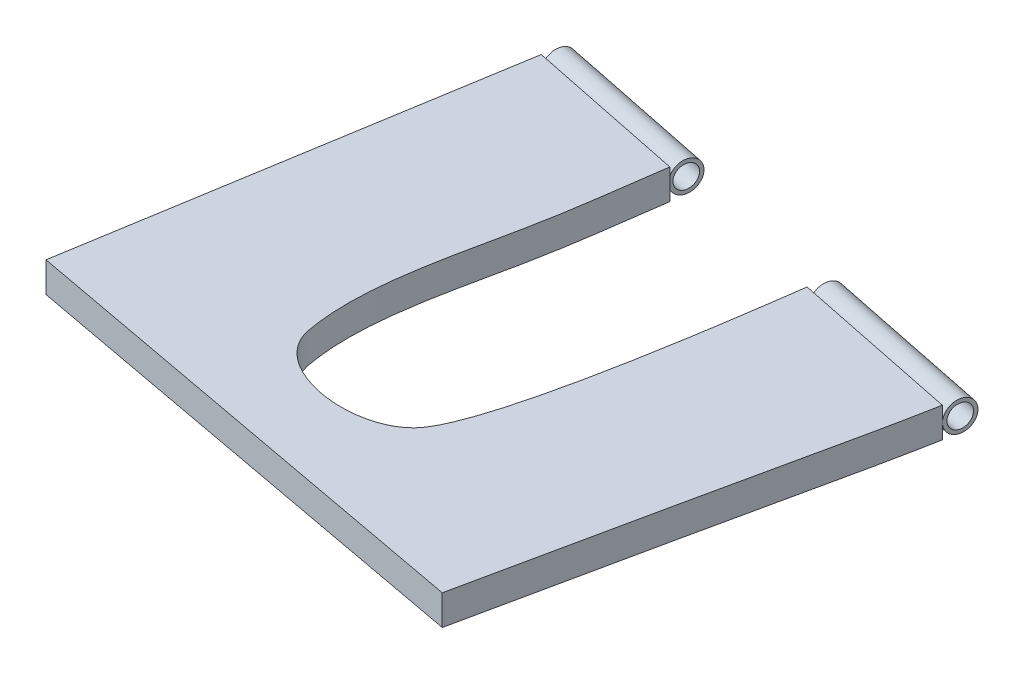
ISO-10303-21;
HEADER;
FILE_DESCRIPTION(('STEP AP214'),'2;1');
FILE_NAME('part.step','',(''),(''),'','','');
FILE_SCHEMA(('AUTOMOTIVE_DESIGN { 1 0 10303 214 1 1 1 1 }'));
ENDSEC;
DATA;
#1=APPLICATION_CONTEXT('core data for automotive mechanical design processes');
#2=APPLICATION_PROTOCOL_DEFINITION('international standard','automotive_design',2000,#1);
#3=PRODUCT_CONTEXT('',#1,'mechanical');
#4=PRODUCT('Part','Part','',(#3));
#5=PRODUCT_RELATED_PRODUCT_CATEGORY('part','',(#4));
#6=PRODUCT_DEFINITION_FORMATION('','',#4);
#7=PRODUCT_DEFINITION_CONTEXT('part definition',#1,'design');
#8=PRODUCT_DEFINITION('design','',#6,#7);
#9=PRODUCT_DEFINITION_SHAPE('','',#8);
#10=(LENGTH_UNIT() NAMED_UNIT(*) SI_UNIT(.MILLI.,.METRE.));
#11=(NAMED_UNIT(*) PLANE_ANGLE_UNIT() SI_UNIT($,.RADIAN.));
#12=(NAMED_UNIT(*) SI_UNIT($,.STERADIAN.) SOLID_ANGLE_UNIT());
#13=UNCERTAINTY_MEASURE_WITH_UNIT(LENGTH_MEASURE(1.E-05),#10,'distance_accuracy_value','');
#14=(GEOMETRIC_REPRESENTATION_CONTEXT(3) GLOBAL_UNCERTAINTY_ASSIGNED_CONTEXT((#13)) GLOBAL_UNIT_ASSIGNED_CONTEXT((#10,
#11,#12)) REPRESENTATION_CONTEXT('',''));
#15=CARTESIAN_POINT('',(0.,0.,0.));
#16=DIRECTION('',(0.,0.,1.));
#17=DIRECTION('',(1.,0.,0.));
#18=AXIS2_PLACEMENT_3D('',#15,#16,#17);
#19=CARTESIAN_POINT('',(34.3393409375104,28.367027058121,41.4201452566164));
#20=DIRECTION('',(-0.979714932282565,0.,-0.200396236148708));
#21=DIRECTION('',(-0.132005290547478,-0.752386940692541,0.645359198232112));
#22=AXIS2_PLACEMENT_3D('',#19,#20,#21);
#23=CYLINDRICAL_SURFACE('',#22,0.5);
#24=CARTESIAN_POINT('',(16.9298065908492,28.367027058121,37.8591041402539));
#25=DIRECTION('',(0.979714932282565,0.,0.200396236148708));
#26=DIRECTION('',(0.132005290547478,0.752386940692541,-0.645359198232112));
#27=AXIS2_PLACEMENT_3D('',#24,#25,#26);
#28=CIRCLE('',#27,0.5);
#29=CARTESIAN_POINT('',(16.9958092361229,28.7432205284673,37.5364245411378));
#30=VERTEX_POINT('',#29);
#31=EDGE_CURVE('P0_E56',#30,#30,#28,.T.);
#32=ORIENTED_EDGE('',*,*,#31,.T.);
#33=EDGE_LOOP('',(#32));
#34=FACE_BOUND('',#33,.T.);
#35=CARTESIAN_POINT('',(22.2467057490344,28.367027058121,38.9466516953372));
#36=DIRECTION('',(-0.979714932282565,0.,-0.200396236148708));
#37=DIRECTION('',(-0.200396236148708,0.,0.979714932282565));
#38=AXIS2_PLACEMENT_3D('',#35,#36,#37);
#39=CIRCLE('',#38,0.5);
#40=CARTESIAN_POINT('',(22.1465076309601,28.367027058121,39.4365091614785));
#41=VERTEX_POINT('',#40);
#42=EDGE_CURVE('P0_E46',#41,#41,#39,.T.);
#43=ORIENTED_EDGE('',*,*,#42,.T.);
#44=EDGE_LOOP('',(#43));
#45=FACE_BOUND('',#44,.T.);
#46=ADVANCED_FACE('P0_F42',(#34,#45),#23,.T.);
#47=CARTESIAN_POINT('',(34.3393409375104,28.367027058121,41.4201452566164));
#48=DIRECTION('',(-0.979714932282565,0.,-0.200396236148708));
#49=DIRECTION('',(-0.132005290547478,-0.752386940692541,0.645359198232112));
#50=AXIS2_PLACEMENT_3D('',#47,#48,#49);
#51=CYLINDRICAL_SURFACE('',#50,0.375);
#52=CARTESIAN_POINT('',(22.2467057490344,28.367027058121,38.9466516953372));
#53=DIRECTION('',(-0.979714932282565,0.,-0.200396236148708));
#54=DIRECTION('',(-0.200396236148708,0.,0.979714932282565));
#55=AXIS2_PLACEMENT_3D('',#52,#53,#54);
#56=CIRCLE('',#55,0.375);
#57=CARTESIAN_POINT('',(22.1715571604787,28.367027058121,39.3140447949432));
#58=VERTEX_POINT('',#57);
#59=EDGE_CURVE('P0_E11',#58,#58,#56,.T.);
#60=ORIENTED_EDGE('',*,*,#59,.F.);
#61=EDGE_LOOP('',(#60));
#62=FACE_BOUND('',#61,.T.);
#63=CARTESIAN_POINT('',(16.9298065908492,28.367027058121,37.8591041402539));
#64=DIRECTION('',(0.979714932282565,0.,0.200396236148708));
#65=DIRECTION('',(0.132005290547478,0.752386940692541,-0.645359198232112));
#66=AXIS2_PLACEMENT_3D('',#63,#64,#65);
#67=CIRCLE('',#66,0.375);
#68=CARTESIAN_POINT('',(16.9793085748045,28.6491721608807,37.6170944409168));
#69=VERTEX_POINT('',#68);
#70=EDGE_CURVE('P0_E50',#69,#69,#67,.T.);
#71=ORIENTED_EDGE('',*,*,#70,.F.);
#72=EDGE_LOOP('',(#71));
#73=FACE_BOUND('',#72,.T.);
#74=ADVANCED_FACE('P0_F44',(#62,#73),#51,.F.);
#75=CARTESIAN_POINT('',(16.9298065908492,28.367027058121,37.8591041402539));
#76=DIRECTION('',(0.979714932282565,0.,0.200396236148708));
#77=DIRECTION('',(0.132005290547478,0.752386940692541,-0.645359198232112));
#78=AXIS2_PLACEMENT_3D('',#75,#76,#77);
#79=PLANE('',#78);
#80=ORIENTED_EDGE('',*,*,#31,.F.);
#81=EDGE_LOOP('',(#80));
#82=FACE_BOUND('',#81,.T.);
#83=ORIENTED_EDGE('',*,*,#70,.T.);
#84=EDGE_LOOP('',(#83));
#85=FACE_BOUND('',#84,.T.);
#86=ADVANCED_FACE('P0_F66',(#82,#85),#79,.F.);
#87=CARTESIAN_POINT('',(22.1465076309606,27.4446270581241,39.4365091614761));
#88=DIRECTION('',(-0.979714932282565,0.,-0.200396236148708));
#89=DIRECTION('',(-0.200396236148708,0.,0.979714932282565));
#90=AXIS2_PLACEMENT_3D('',#87,#88,#89);
#91=PLANE('',#90);
#92=ORIENTED_EDGE('',*,*,#59,.T.);
#93=EDGE_LOOP('',(#92));
#94=FACE_BOUND('',#93,.T.);
#95=ORIENTED_EDGE('',*,*,#42,.F.);
#96=EDGE_LOOP('',(#95));
#97=FACE_BOUND('',#96,.T.);
#98=ADVANCED_FACE('P0_F64',(#94,#97),#91,.F.);
#99=CLOSED_SHELL('',(#46,#74,#86,#98));
#100=MANIFOLD_SOLID_BREP('P0_B2',#99);
#101=CARTESIAN_POINT('',(34.3393409375104,28.367027058121,41.4201452566164));
#102=DIRECTION('',(-0.979714932282565,0.,-0.200396236148708));
#103=DIRECTION('',(-0.132005290547478,-0.752386940692541,0.645359198232112));
#104=AXIS2_PLACEMENT_3D('',#101,#102,#103);
#105=CYLINDRICAL_SURFACE('',#104,0.5);
#106=CARTESIAN_POINT('',(28.1249953427298,28.367027058121,40.1490291122295));
#107=DIRECTION('',(0.979714932282565,0.,0.200396236148708));
#108=DIRECTION('',(0.200396236148708,0.,-0.979714932282565));
#109=AXIS2_PLACEMENT_3D('',#106,#107,#108);
#110=CIRCLE('',#109,0.5);
#111=CARTESIAN_POINT('',(28.2251934608042,28.367027058121,39.6591716460882));
#112=VERTEX_POINT('',#111);
#113=EDGE_CURVE('P0_E115',#112,#112,#110,.T.);
#114=ORIENTED_EDGE('',*,*,#113,.T.);
#115=EDGE_LOOP('',(#114));
#116=FACE_BOUND('',#115,.T.);
#117=CARTESIAN_POINT('',(33.692337196231,28.367027058121,41.2878035822638));
#118=DIRECTION('',(0.979714932282566,0.,0.200396236148705));
#119=DIRECTION('',(0.200396236148705,0.,-0.979714932282566));
#120=AXIS2_PLACEMENT_3D('',#117,#118,#119);
#121=CIRCLE('',#120,0.5);
#122=CARTESIAN_POINT('',(33.7925353143053,28.367027058121,40.7979461161225));
#123=VERTEX_POINT('',#122);
#124=EDGE_CURVE('P0_E41',#123,#123,#121,.T.);
#125=ORIENTED_EDGE('',*,*,#124,.F.);
#126=EDGE_LOOP('',(#125));
#127=FACE_BOUND('',#126,.T.);
#128=ADVANCED_FACE('P0_F103',(#116,#127),#105,.T.);
#129=CARTESIAN_POINT('',(40.4453817701932,1.1135307542517E-13,8.27291899844854));
#130=DIRECTION('',(0.979714932282566,0.,0.200396236148705));
#131=DIRECTION('',(0.200396236148705,0.,-0.979714932282566));
#132=AXIS2_PLACEMENT_3D('',#129,#130,#131);
#133=PLANE('',#132);
#134=CARTESIAN_POINT('',(33.692337196231,28.367027058121,41.2878035822638));
#135=DIRECTION('',(0.979714932282566,0.,0.200396236148705));
#136=DIRECTION('',(0.200396236148705,0.,-0.979714932282566));
#137=AXIS2_PLACEMENT_3D('',#134,#135,#136);
#138=CIRCLE('',#137,0.375);
#139=CARTESIAN_POINT('',(33.7674857847867,28.367027058121,40.9204104826578));
#140=VERTEX_POINT('',#139);
#141=EDGE_CURVE('P0_E110',#140,#140,#138,.T.);
#142=ORIENTED_EDGE('',*,*,#141,.F.);
#143=EDGE_LOOP('',(#142));
#144=FACE_BOUND('',#143,.T.);
#145=ORIENTED_EDGE('',*,*,#124,.T.);
#146=EDGE_LOOP('',(#145));
#147=FACE_BOUND('',#146,.T.);
#148=ADVANCED_FACE('P0_F129',(#144,#147),#133,.T.);
#149=CARTESIAN_POINT('',(34.3393409375104,28.367027058121,41.4201452566164));
#150=DIRECTION('',(-0.979714932282565,0.,-0.200396236148708));
#151=DIRECTION('',(-0.132005290547478,-0.752386940692541,0.645359198232112));
#152=AXIS2_PLACEMENT_3D('',#149,#150,#151);
#153=CYLINDRICAL_SURFACE('',#152,0.375);
#154=CARTESIAN_POINT('',(28.1249953427298,28.367027058121,40.1490291122295));
#155=DIRECTION('',(0.979714932282565,0.,0.200396236148708));
#156=DIRECTION('',(0.200396236148708,0.,-0.979714932282565));
#157=AXIS2_PLACEMENT_3D('',#154,#155,#156);
#158=CIRCLE('',#157,0.375);
#159=CARTESIAN_POINT('',(28.2001439312856,28.367027058121,39.7816360126235));
#160=VERTEX_POINT('',#159);
#161=EDGE_CURVE('P0_E106',#160,#160,#158,.T.);
#162=ORIENTED_EDGE('',*,*,#161,.F.);
#163=EDGE_LOOP('',(#162));
#164=FACE_BOUND('',#163,.T.);
#165=ORIENTED_EDGE('',*,*,#141,.T.);
#166=EDGE_LOOP('',(#165));
#167=FACE_BOUND('',#166,.T.);
#168=ADVANCED_FACE('P0_F126',(#164,#167),#153,.F.);
#169=CARTESIAN_POINT('',(28.3029419316506,27.4446270581241,39.2790680108389));
#170=DIRECTION('',(0.979714932282565,0.,0.200396236148708));
#171=DIRECTION('',(0.200396236148708,0.,-0.979714932282565));
#172=AXIS2_PLACEMENT_3D('',#169,#170,#171);
#173=PLANE('',#172);
#174=ORIENTED_EDGE('',*,*,#161,.T.);
#175=EDGE_LOOP('',(#174));
#176=FACE_BOUND('',#175,.T.);
#177=ORIENTED_EDGE('',*,*,#113,.F.);
#178=EDGE_LOOP('',(#177));
#179=FACE_BOUND('',#178,.T.);
#180=ADVANCED_FACE('P0_F123',(#176,#179),#173,.F.);
#181=CLOSED_SHELL('',(#128,#148,#168,#180));
#182=MANIFOLD_SOLID_BREP('P0_B6',#181);
#183=CARTESIAN_POINT('',(36.6387428812628,28.8670270581241,-14.2615422954194));
#184=DIRECTION('',(0.,1.,0.));
#185=DIRECTION('',(0.,0.,1.));
#186=AXIS2_PLACEMENT_3D('',#183,#184,#185);
#187=PLANE('',#186);
#188=DIRECTION('',(0.979714932282565,0.,0.200396236148708));
#189=VECTOR('',#188,1.);
#190=CARTESIAN_POINT('',(16.8301205467723,28.8670270581241,38.3490663488012));
#191=LINE('',#190,#189);
#192=CARTESIAN_POINT('',(16.8301205467723,28.8670270581241,38.3490663488012));
#193=VERTEX_POINT('',#192);
#194=CARTESIAN_POINT('',(22.2008761425066,28.8670270581241,39.4476299933832));
#195=VERTEX_POINT('',#194);
#196=EDGE_CURVE('P1_E61',#193,#195,#191,.T.);
#197=ORIENTED_EDGE('',*,*,#196,.F.);
#198=DIRECTION('',(-0.162010149383469,0.,0.986789091699308));
#199=VECTOR('',#198,1.);
#200=CARTESIAN_POINT('',(14.50947597592,28.8670270581241,52.4839014621741));
#201=LINE('',#200,#199);
#202=CARTESIAN_POINT('',(14.50947597592,28.8670270581241,52.4839014621741));
#203=VERTEX_POINT('',#202);
#204=EDGE_CURVE('P1_E89',#193,#203,#201,.T.);
#205=ORIENTED_EDGE('',*,*,#204,.T.);
#206=DIRECTION('',(0.983229382627469,0.,0.182373191938966));
#207=VECTOR('',#206,1.);
#208=CARTESIAN_POINT('',(30.6744525972207,28.8670270581241,55.482243899996));
#209=LINE('',#208,#207);
#210=CARTESIAN_POINT('',(30.6744525972207,28.8670270581241,55.482243899996));
#211=VERTEX_POINT('',#210);
#212=EDGE_CURVE('P1_E41',#203,#211,#209,.T.);
#213=ORIENTED_EDGE('',*,*,#212,.T.);
#214=CARTESIAN_POINT('',(30.6744525972207,28.8670270581241,55.482243899996));
#215=CARTESIAN_POINT('',(31.4566288853481,28.8670270581241,51.8320878887345));
#216=CARTESIAN_POINT('',(32.2156641647427,28.8670270581241,48.176896262527));
#217=CARTESIAN_POINT('',(33.020981461603,28.8670270581241,44.5317758662117));
#218=CARTESIAN_POINT('',(34.0674237797334,28.8670270581241,39.7952474788846));
#219=CARTESIAN_POINT('',(34.7004152100653,28.8670270581241,34.97662423419));
#220=CARTESIAN_POINT('',(35.4978730406733,28.8670270581241,30.1918772505417));
#221=B_SPLINE_CURVE_WITH_KNOTS('',3,(#214,#215,#216,#217,#218,#219,#220),.UNSPECIFIED.,.F.,.F.,
(4,3,4),(0.,1.,2.),.UNSPECIFIED.);
#222=CARTESIAN_POINT('',(33.5857089999997,28.8670270581241,41.7763458051432));
#223=VERTEX_POINT('',#222);
#224=EDGE_CURVE('P1_E102',#211,#223,#221,.T.);
#225=ORIENTED_EDGE('',*,*,#224,.T.);
#226=CARTESIAN_POINT('',(27.9368355887746,28.8670270581241,40.6208944255744));
#227=VERTEX_POINT('',#226);
#228=EDGE_CURVE('P1_E94',#227,#223,#191,.T.);
#229=ORIENTED_EDGE('',*,*,#228,.F.);
#230=CARTESIAN_POINT('',(22.2008761425066,28.8670270581241,39.4476299933832));
#231=CARTESIAN_POINT('',(22.0270591895894,28.8670270581241,40.6208944255744));
#232=CARTESIAN_POINT('',(21.8879252653,28.8670270581241,41.7998233933046));
#233=CARTESIAN_POINT('',(21.679425283755,28.8670270581241,42.9674232899568));
#234=CARTESIAN_POINT('',(21.2757244699401,28.8670270581241,45.2281478473201));
#235=CARTESIAN_POINT('',(20.4703015625089,28.8670270581241,47.7891617156389));
#236=CARTESIAN_POINT('',(20.8972489956276,28.8670270581241,50.1373725977917));
#237=CARTESIAN_POINT('',(21.2251484352439,28.8670270581241,51.9408195156814));
#238=CARTESIAN_POINT('',(24.6285914859558,28.8670270581241,52.3722700534572));
#239=CARTESIAN_POINT('',(25.5903067243923,28.8670270581241,51.0499116006071));
#240=CARTESIAN_POINT('',(26.8258771149065,28.8670270581241,49.3510023136501));
#241=CARTESIAN_POINT('',(27.8536887119159,28.8670270581241,41.1301690463338));
#242=CARTESIAN_POINT('',(27.9368355887746,28.8670270581241,40.6208944255744));
#243=B_SPLINE_CURVE_WITH_KNOTS('',3,(#230,#231,#232,#233,#234,#235,#236,#237,#238,#239,#240,
#241,#242),.UNSPECIFIED.,.F.,.F.,(4,3,3,3,4),(0.,1.,2.,3.,4.),.UNSPECIFIED.);
#244=EDGE_CURVE('P1_E92',#195,#227,#243,.T.);
#245=ORIENTED_EDGE('',*,*,#244,.F.);
#246=EDGE_LOOP('',(#197,#205,#213,#225,#229,#245));
#247=FACE_BOUND('',#246,.T.);
#248=ADVANCED_FACE('P1_F23',(#247),#187,.T.);
#249=CARTESIAN_POINT('',(36.6387428812628,27.8670270581241,-14.2615422954194));
#250=DIRECTION('',(0.,1.,0.));
#251=DIRECTION('',(0.,0.,1.));
#252=AXIS2_PLACEMENT_3D('',#249,#250,#251);
#253=PLANE('',#252);
#254=DIRECTION('',(-0.162010149383469,0.,0.986789091699308));
#255=VECTOR('',#254,1.);
#256=CARTESIAN_POINT('',(14.50947597592,27.8670270581241,52.4839014621741));
#257=LINE('',#256,#255);
#258=CARTESIAN_POINT('',(16.8301205467723,27.8670270581241,38.3490663488012));
#259=VERTEX_POINT('',#258);
#260=CARTESIAN_POINT('',(14.50947597592,27.8670270581241,52.4839014621741));
#261=VERTEX_POINT('',#260);
#262=EDGE_CURVE('P1_E52',#259,#261,#257,.T.);
#263=ORIENTED_EDGE('',*,*,#262,.F.);
#264=DIRECTION('',(0.979714932282565,0.,0.200396236148708));
#265=VECTOR('',#264,1.);
#266=CARTESIAN_POINT('',(25.5141521860693,27.8670270581241,40.1253455477483));
#267=LINE('',#266,#265);
#268=CARTESIAN_POINT('',(22.2008761425066,27.8670270581241,39.4476299933832));
#269=VERTEX_POINT('',#268);
#270=EDGE_CURVE('P1_E83',#259,#269,#267,.T.);
#271=ORIENTED_EDGE('',*,*,#270,.T.);
#272=CARTESIAN_POINT('',(22.2008761425066,27.8670270581241,39.4476299933832));
#273=CARTESIAN_POINT('',(22.0270591895894,27.8670270581241,40.6208944255744));
#274=CARTESIAN_POINT('',(21.8879252653,27.8670270581241,41.7998233933046));
#275=CARTESIAN_POINT('',(21.679425283755,27.8670270581241,42.9674232899568));
#276=CARTESIAN_POINT('',(21.2757244699401,27.8670270581241,45.2281478473201));
#277=CARTESIAN_POINT('',(20.4703015625089,27.8670270581241,47.7891617156389));
#278=CARTESIAN_POINT('',(20.8972489956276,27.8670270581241,50.1373725977917));
#279=CARTESIAN_POINT('',(21.2251484352439,27.8670270581241,51.9408195156814));
#280=CARTESIAN_POINT('',(24.6285914859558,27.8670270581241,52.3722700534572));
#281=CARTESIAN_POINT('',(25.5903067243923,27.8670270581241,51.0499116006071));
#282=CARTESIAN_POINT('',(26.8258771149065,27.8670270581241,49.3510023136501));
#283=CARTESIAN_POINT('',(27.8536887119159,27.8670270581241,41.1301690463338));
#284=CARTESIAN_POINT('',(27.9368355887746,27.8670270581241,40.6208944255744));
#285=B_SPLINE_CURVE_WITH_KNOTS('',3,(#272,#273,#274,#275,#276,#277,#278,#279,#280,#281,#282,
#283,#284),.UNSPECIFIED.,.F.,.F.,(4,3,3,3,4),(0.,1.,2.,3.,4.),.UNSPECIFIED.);
#286=CARTESIAN_POINT('',(27.9368355887746,27.8670270581241,40.6208944255744));
#287=VERTEX_POINT('',#286);
#288=EDGE_CURVE('P1_E153',#269,#287,#285,.T.);
#289=ORIENTED_EDGE('',*,*,#288,.T.);
#290=CARTESIAN_POINT('',(33.5857089999997,27.8670270581241,41.7763458051432));
#291=VERTEX_POINT('',#290);
#292=EDGE_CURVE('P1_E154',#287,#291,#267,.T.);
#293=ORIENTED_EDGE('',*,*,#292,.T.);
#294=CARTESIAN_POINT('',(30.6744525972207,27.8670270581241,55.482243899996));
#295=CARTESIAN_POINT('',(31.4566288853481,27.8670270581241,51.8320878887345));
#296=CARTESIAN_POINT('',(32.2156641647427,27.8670270581241,48.176896262527));
#297=CARTESIAN_POINT('',(33.020981461603,27.8670270581241,44.5317758662117));
#298=CARTESIAN_POINT('',(34.0674237797334,27.8670270581241,39.7952474788846));
#299=CARTESIAN_POINT('',(34.7004152100653,27.8670270581241,34.97662423419));
#300=CARTESIAN_POINT('',(35.4978730406733,27.8670270581241,30.1918772505417));
#301=B_SPLINE_CURVE_WITH_KNOTS('',3,(#294,#295,#296,#297,#298,#299,#300),.UNSPECIFIED.,.F.,.F.,
(4,3,4),(0.,1.,2.),.UNSPECIFIED.);
#302=CARTESIAN_POINT('',(30.6744525972207,27.8670270581241,55.482243899996));
#303=VERTEX_POINT('',#302);
#304=EDGE_CURVE('P1_E97',#303,#291,#301,.T.);
#305=ORIENTED_EDGE('',*,*,#304,.F.);
#306=DIRECTION('',(0.983229382627469,0.,0.182373191938966));
#307=VECTOR('',#306,1.);
#308=CARTESIAN_POINT('',(30.6744525972207,27.8670270581241,55.482243899996));
#309=LINE('',#308,#307);
#310=EDGE_CURVE('P1_E105',#261,#303,#309,.T.);
#311=ORIENTED_EDGE('',*,*,#310,.F.);
#312=EDGE_LOOP('',(#263,#271,#289,#293,#305,#311));
#313=FACE_BOUND('',#312,.T.);
#314=ADVANCED_FACE('P1_F127',(#313),#253,.F.);
#315=CARTESIAN_POINT('',(14.50947597592,28.8670270581241,52.4839014621741));
#316=DIRECTION('',(0.986789091699309,0.,0.162010149383469));
#317=DIRECTION('',(0.162010149383469,0.,-0.986789091699309));
#318=AXIS2_PLACEMENT_3D('',#315,#316,#317);
#319=PLANE('',#318);
#320=ORIENTED_EDGE('',*,*,#204,.F.);
#321=DIRECTION('',(0.,1.,0.));
#322=VECTOR('',#321,1.);
#323=CARTESIAN_POINT('',(16.8301205467723,18.8670270581241,38.3490663488012));
#324=LINE('',#323,#322);
#325=EDGE_CURVE('P1_E80',#259,#193,#324,.T.);
#326=ORIENTED_EDGE('',*,*,#325,.F.);
#327=ORIENTED_EDGE('',*,*,#262,.T.);
#328=DIRECTION('',(0.,-1.,0.));
#329=VECTOR('',#328,1.);
#330=CARTESIAN_POINT('',(14.50947597592,28.8670270581241,52.4839014621741));
#331=LINE('',#330,#329);
#332=EDGE_CURVE('P1_E13',#203,#261,#331,.T.);
#333=ORIENTED_EDGE('',*,*,#332,.F.);
#334=EDGE_LOOP('',(#320,#326,#327,#333));
#335=FACE_BOUND('',#334,.T.);
#336=ADVANCED_FACE('P1_F25',(#335),#319,.F.);
#337=CARTESIAN_POINT('',(30.6744525972207,28.8670270581241,55.482243899996));
#338=DIRECTION('',(0.182373191938966,0.,-0.983229382627469));
#339=DIRECTION('',(-0.983229382627469,0.,-0.182373191938966));
#340=AXIS2_PLACEMENT_3D('',#337,#338,#339);
#341=PLANE('',#340);
#342=ORIENTED_EDGE('',*,*,#310,.T.);
#343=DIRECTION('',(0.,-1.,0.));
#344=VECTOR('',#343,1.);
#345=CARTESIAN_POINT('',(30.6744525972207,28.8670270581241,55.482243899996));
#346=LINE('',#345,#344);
#347=EDGE_CURVE('P1_E33',#211,#303,#346,.T.);
#348=ORIENTED_EDGE('',*,*,#347,.F.);
#349=ORIENTED_EDGE('',*,*,#212,.F.);
#350=ORIENTED_EDGE('',*,*,#332,.T.);
#351=EDGE_LOOP('',(#342,#348,#349,#350));
#352=FACE_BOUND('',#351,.T.);
#353=ADVANCED_FACE('P1_F125',(#352),#341,.F.);
#354=DIRECTION('',(0.,-1.,0.));
#355=VECTOR('',#354,1.);
#356=SURFACE_OF_LINEAR_EXTRUSION('',#221,#355);
#357=ORIENTED_EDGE('',*,*,#304,.T.);
#358=DIRECTION('',(0.,1.,0.));
#359=VECTOR('',#358,1.);
#360=CARTESIAN_POINT('',(33.5857089999997,18.8670270581241,41.7763458051432));
#361=LINE('',#360,#359);
#362=EDGE_CURVE('P1_E86',#291,#223,#361,.T.);
#363=ORIENTED_EDGE('',*,*,#362,.T.);
#364=ORIENTED_EDGE('',*,*,#224,.F.);
#365=ORIENTED_EDGE('',*,*,#347,.T.);
#366=EDGE_LOOP('',(#357,#363,#364,#365));
#367=FACE_BOUND('',#366,.T.);
#368=ADVANCED_FACE('P1_F121',(#367),#356,.F.);
#369=DIRECTION('',(0.,-1.,0.));
#370=VECTOR('',#369,1.);
#371=SURFACE_OF_LINEAR_EXTRUSION('',#243,#370);
#372=ORIENTED_EDGE('',*,*,#288,.F.);
#373=DIRECTION('',(0.,-1.,0.));
#374=VECTOR('',#373,1.);
#375=CARTESIAN_POINT('',(22.2008761425066,28.8670270581241,39.4476299933832));
#376=LINE('',#375,#374);
#377=EDGE_CURVE('P1_E152',#195,#269,#376,.T.);
#378=ORIENTED_EDGE('',*,*,#377,.F.);
#379=ORIENTED_EDGE('',*,*,#244,.T.);
#380=DIRECTION('',(0.,-1.,0.));
#381=VECTOR('',#380,1.);
#382=CARTESIAN_POINT('',(27.9368355887746,28.8670270581241,40.6208944255744));
#383=LINE('',#382,#381);
#384=EDGE_CURVE('P1_E108',#227,#287,#383,.T.);
#385=ORIENTED_EDGE('',*,*,#384,.T.);
#386=EDGE_LOOP('',(#372,#378,#379,#385));
#387=FACE_BOUND('',#386,.T.);
#388=ADVANCED_FACE('P1_F124',(#387),#371,.T.);
#389=CARTESIAN_POINT('',(16.8301205467723,18.8670270581241,38.3490663488012));
#390=DIRECTION('',(-0.200396236148708,0.,0.979714932282565));
#391=DIRECTION('',(0.979714932282565,0.,0.200396236148708));
#392=AXIS2_PLACEMENT_3D('',#389,#390,#391);
#393=PLANE('',#392);
#394=ORIENTED_EDGE('',*,*,#384,.F.);
#395=ORIENTED_EDGE('',*,*,#228,.T.);
#396=ORIENTED_EDGE('',*,*,#362,.F.);
#397=ORIENTED_EDGE('',*,*,#292,.F.);
#398=EDGE_LOOP('',(#394,#395,#396,#397));
#399=FACE_BOUND('',#398,.T.);
#400=ADVANCED_FACE('P1_F144',(#399),#393,.F.);
#401=ORIENTED_EDGE('',*,*,#325,.T.);
#402=ORIENTED_EDGE('',*,*,#196,.T.);
#403=ORIENTED_EDGE('',*,*,#377,.T.);
#404=ORIENTED_EDGE('',*,*,#270,.F.);
#405=EDGE_LOOP('',(#401,#402,#403,#404));
#406=FACE_BOUND('',#405,.T.);
#407=ADVANCED_FACE('P1_F81',(#406),#393,.F.);
#408=CLOSED_SHELL('',(#248,#314,#336,#353,#368,#388,#400,#407));
#409=MANIFOLD_SOLID_BREP('P1_B1',#408);
#410=ADVANCED_BREP_SHAPE_REPRESENTATION('',(#18,#100,#182,#409),#14);
#411=SHAPE_DEFINITION_REPRESENTATION(#9,#410);
ENDSEC;
END-ISO-10303-21;
